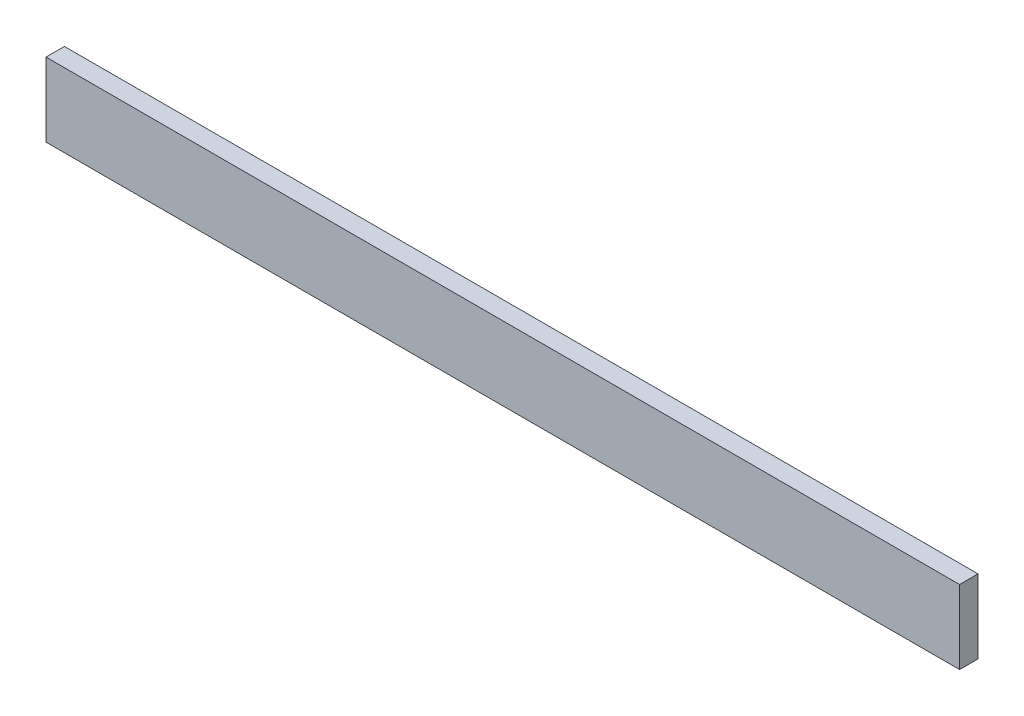
ISO-10303-21;
HEADER;
FILE_DESCRIPTION(('STEP AP214'),'2;1');
FILE_NAME('part.step','',(''),(''),'','','');
FILE_SCHEMA(('AUTOMOTIVE_DESIGN { 1 0 10303 214 1 1 1 1 }'));
ENDSEC;
DATA;
#1=APPLICATION_CONTEXT('core data for automotive mechanical design processes');
#2=APPLICATION_PROTOCOL_DEFINITION('international standard','automotive_design',2000,#1);
#3=PRODUCT_CONTEXT('',#1,'mechanical');
#4=PRODUCT('Part','Part','',(#3));
#5=PRODUCT_RELATED_PRODUCT_CATEGORY('part','',(#4));
#6=PRODUCT_DEFINITION_FORMATION('','',#4);
#7=PRODUCT_DEFINITION_CONTEXT('part definition',#1,'design');
#8=PRODUCT_DEFINITION('design','',#6,#7);
#9=PRODUCT_DEFINITION_SHAPE('','',#8);
#10=(LENGTH_UNIT() NAMED_UNIT(*) SI_UNIT(.MILLI.,.METRE.));
#11=(NAMED_UNIT(*) PLANE_ANGLE_UNIT() SI_UNIT($,.RADIAN.));
#12=(NAMED_UNIT(*) SI_UNIT($,.STERADIAN.) SOLID_ANGLE_UNIT());
#13=UNCERTAINTY_MEASURE_WITH_UNIT(LENGTH_MEASURE(1.E-05),#10,'distance_accuracy_value','');
#14=(GEOMETRIC_REPRESENTATION_CONTEXT(3) GLOBAL_UNCERTAINTY_ASSIGNED_CONTEXT((#13)) GLOBAL_UNIT_ASSIGNED_CONTEXT((#10,
#11,#12)) REPRESENTATION_CONTEXT('',''));
#15=CARTESIAN_POINT('',(0.,0.,0.));
#16=DIRECTION('',(0.,0.,1.));
#17=DIRECTION('',(1.,0.,0.));
#18=AXIS2_PLACEMENT_3D('',#15,#16,#17);
#19=CARTESIAN_POINT('',(-216.715145397951,0.792942432842177,1.58738372791299));
#20=DIRECTION('',(2.67172428951962E-06,-0.999999999996431,-7.96373623806783E-12));
#21=DIRECTION('',(0.999999999996431,2.67172428951962E-06,0.));
#22=AXIS2_PLACEMENT_3D('',#19,#20,#21);
#23=PLANE('',#22);
#24=DIRECTION('',(-0.999999999991989,-2.67172428953149E-06,2.98074777747218E-06));
#25=VECTOR('',#24,1.);
#26=CARTESIAN_POINT('',(-216.715150129888,0.792942432842177,-0.000116272079955003));
#27=LINE('',#26,#25);
#28=CARTESIAN_POINT('',(-216.715150129888,0.792942432842177,-0.000116272079955003));
#29=VERTEX_POINT('',#28);
#30=CARTESIAN_POINT('',(-295.456298150369,0.792732058204423,0.000118435422004534));
#31=VERTEX_POINT('',#30);
#32=EDGE_CURVE('E95',#29,#31,#27,.T.);
#33=ORIENTED_EDGE('',*,*,#32,.T.);
#34=DIRECTION('',(-2.98074777748281E-06,0.,-0.999999999995558));
#35=VECTOR('',#34,1.);
#36=CARTESIAN_POINT('',(-295.456293418432,0.792732058204423,1.58761843541495));
#37=LINE('',#36,#35);
#38=CARTESIAN_POINT('',(-295.456293418432,0.792732058204423,1.58761843541495));
#39=VERTEX_POINT('',#38);
#40=EDGE_CURVE('E11',#39,#31,#37,.T.);
#41=ORIENTED_EDGE('',*,*,#40,.F.);
#42=DIRECTION('',(-0.999999999991989,-2.67172428953149E-06,2.98074777747218E-06));
#43=VECTOR('',#42,1.);
#44=CARTESIAN_POINT('',(-216.715145397951,0.792942432842177,1.58738372791299));
#45=LINE('',#44,#43);
#46=CARTESIAN_POINT('',(-216.715145397951,0.792942432842177,1.58738372791299));
#47=VERTEX_POINT('',#46);
#48=EDGE_CURVE('E83',#47,#39,#45,.T.);
#49=ORIENTED_EDGE('',*,*,#48,.F.);
#50=DIRECTION('',(-2.98074777748281E-06,0.,-0.999999999995558));
#51=VECTOR('',#50,1.);
#52=CARTESIAN_POINT('',(-216.715145397951,0.792942432842177,1.58738372791299));
#53=LINE('',#52,#51);
#54=EDGE_CURVE('E91',#47,#29,#53,.T.);
#55=ORIENTED_EDGE('',*,*,#54,.T.);
#56=EDGE_LOOP('',(#33,#41,#49,#55));
#57=FACE_BOUND('',#56,.T.);
#58=ADVANCED_FACE('F32',(#57),#23,.F.);
#59=CARTESIAN_POINT('',(-295.456293418432,0.792732058204423,1.58761843541495));
#60=DIRECTION('',(0.999999999995558,0.,-2.98074777748281E-06));
#61=DIRECTION('',(-2.98074777748281E-06,0.,-0.999999999995558));
#62=AXIS2_PLACEMENT_3D('',#59,#60,#61);
#63=PLANE('',#62);
#64=DIRECTION('',(0.,-1.,0.));
#65=VECTOR('',#64,1.);
#66=CARTESIAN_POINT('',(-295.456298150369,0.792732058204423,0.000118435422004534));
#67=LINE('',#66,#65);
#68=CARTESIAN_POINT('',(-295.456298150369,-5.55726794179557,0.000118435422004534));
#69=VERTEX_POINT('',#68);
#70=EDGE_CURVE('E87',#31,#69,#67,.T.);
#71=ORIENTED_EDGE('',*,*,#70,.T.);
#72=DIRECTION('',(-2.98074777748281E-06,0.,-0.999999999995558));
#73=VECTOR('',#72,1.);
#74=CARTESIAN_POINT('',(-295.456293418432,-5.55726794179557,1.58761843541495));
#75=LINE('',#74,#73);
#76=CARTESIAN_POINT('',(-295.456293418432,-5.55726794179557,1.58761843541495));
#77=VERTEX_POINT('',#76);
#78=EDGE_CURVE('E40',#77,#69,#75,.T.);
#79=ORIENTED_EDGE('',*,*,#78,.F.);
#80=DIRECTION('',(0.,-1.,0.));
#81=VECTOR('',#80,1.);
#82=CARTESIAN_POINT('',(-295.456293418432,0.792732058204423,1.58761843541495));
#83=LINE('',#82,#81);
#84=EDGE_CURVE('E78',#39,#77,#83,.T.);
#85=ORIENTED_EDGE('',*,*,#84,.F.);
#86=ORIENTED_EDGE('',*,*,#40,.T.);
#87=EDGE_LOOP('',(#71,#79,#85,#86));
#88=FACE_BOUND('',#87,.T.);
#89=ADVANCED_FACE('F86',(#88),#63,.F.);
#90=CARTESIAN_POINT('',(-295.456293418432,-5.55726794179557,1.58761843541495));
#91=DIRECTION('',(-2.67172428938743E-06,0.999999999996431,7.96373623767382E-12));
#92=DIRECTION('',(-0.999999999996431,-2.67172428938743E-06,0.));
#93=AXIS2_PLACEMENT_3D('',#90,#91,#92);
#94=PLANE('',#93);
#95=DIRECTION('',(0.999999999991989,2.6717242893993E-06,-2.98074777747218E-06));
#96=VECTOR('',#95,1.);
#97=CARTESIAN_POINT('',(-295.456298150369,-5.55726794179557,0.000118435422004534));
#98=LINE('',#97,#96);
#99=CARTESIAN_POINT('',(-216.715150129888,-5.55705756715783,-0.000116272079955003));
#100=VERTEX_POINT('',#99);
#101=EDGE_CURVE('E65',#69,#100,#98,.T.);
#102=ORIENTED_EDGE('',*,*,#101,.T.);
#103=DIRECTION('',(-2.98074777748281E-06,0.,-0.999999999995558));
#104=VECTOR('',#103,1.);
#105=CARTESIAN_POINT('',(-216.715145397951,-5.55705756715783,1.58738372791299));
#106=LINE('',#105,#104);
#107=CARTESIAN_POINT('',(-216.715145397951,-5.55705756715783,1.58738372791299));
#108=VERTEX_POINT('',#107);
#109=EDGE_CURVE('E88',#108,#100,#106,.T.);
#110=ORIENTED_EDGE('',*,*,#109,.F.);
#111=DIRECTION('',(0.999999999991989,2.6717242893993E-06,-2.98074777747218E-06));
#112=VECTOR('',#111,1.);
#113=CARTESIAN_POINT('',(-295.456293418432,-5.55726794179557,1.58761843541495));
#114=LINE('',#113,#112);
#115=EDGE_CURVE('E81',#77,#108,#114,.T.);
#116=ORIENTED_EDGE('',*,*,#115,.F.);
#117=ORIENTED_EDGE('',*,*,#78,.T.);
#118=EDGE_LOOP('',(#102,#110,#116,#117));
#119=FACE_BOUND('',#118,.T.);
#120=ADVANCED_FACE('F89',(#119),#94,.F.);
#121=CARTESIAN_POINT('',(-216.715145397951,-5.55705756715783,1.58738372791299));
#122=DIRECTION('',(-0.999999999995558,0.,2.98074777748281E-06));
#123=DIRECTION('',(2.98074777748281E-06,0.,0.999999999995558));
#124=AXIS2_PLACEMENT_3D('',#121,#122,#123);
#125=PLANE('',#124);
#126=DIRECTION('',(0.,1.,0.));
#127=VECTOR('',#126,1.);
#128=CARTESIAN_POINT('',(-216.715150129888,-5.55705756715783,-0.000116272079955003));
#129=LINE('',#128,#127);
#130=EDGE_CURVE('E71',#100,#29,#129,.T.);
#131=ORIENTED_EDGE('',*,*,#130,.T.);
#132=ORIENTED_EDGE('',*,*,#54,.F.);
#133=DIRECTION('',(0.,1.,0.));
#134=VECTOR('',#133,1.);
#135=CARTESIAN_POINT('',(-216.715145397951,-5.55705756715783,1.58738372791299));
#136=LINE('',#135,#134);
#137=EDGE_CURVE('E48',#108,#47,#136,.T.);
#138=ORIENTED_EDGE('',*,*,#137,.F.);
#139=ORIENTED_EDGE('',*,*,#109,.T.);
#140=EDGE_LOOP('',(#131,#132,#138,#139));
#141=FACE_BOUND('',#140,.T.);
#142=ADVANCED_FACE('F102',(#141),#125,.F.);
#143=CARTESIAN_POINT('',(4.7296650358236E-06,0.,1.5867377547109));
#144=DIRECTION('',(2.98074777748281E-06,0.,0.999999999995558));
#145=DIRECTION('',(0.999999999995558,0.,-2.98074777748281E-06));
#146=AXIS2_PLACEMENT_3D('',#143,#144,#145);
#147=PLANE('',#146);
#148=ORIENTED_EDGE('',*,*,#48,.T.);
#149=ORIENTED_EDGE('',*,*,#84,.T.);
#150=ORIENTED_EDGE('',*,*,#115,.T.);
#151=ORIENTED_EDGE('',*,*,#137,.T.);
#152=EDGE_LOOP('',(#148,#149,#150,#151));
#153=FACE_BOUND('',#152,.T.);
#154=ADVANCED_FACE('F79',(#153),#147,.T.);
#155=CARTESIAN_POINT('',(-2.27206093037029E-09,0.,-0.000762245282047619));
#156=DIRECTION('',(2.98074777748281E-06,0.,0.999999999995558));
#157=DIRECTION('',(0.999999999995558,0.,-2.98074777748281E-06));
#158=AXIS2_PLACEMENT_3D('',#155,#156,#157);
#159=PLANE('',#158);
#160=ORIENTED_EDGE('',*,*,#32,.F.);
#161=ORIENTED_EDGE('',*,*,#130,.F.);
#162=ORIENTED_EDGE('',*,*,#101,.F.);
#163=ORIENTED_EDGE('',*,*,#70,.F.);
#164=EDGE_LOOP('',(#160,#161,#162,#163));
#165=FACE_BOUND('',#164,.T.);
#166=ADVANCED_FACE('F105',(#165),#159,.F.);
#167=CLOSED_SHELL('',(#58,#89,#120,#142,#154,#166));
#168=MANIFOLD_SOLID_BREP('B2',#167);
#169=ADVANCED_BREP_SHAPE_REPRESENTATION('',(#18,#168),#14);
#170=SHAPE_DEFINITION_REPRESENTATION(#9,#169);
ENDSEC;
END-ISO-10303-21;
